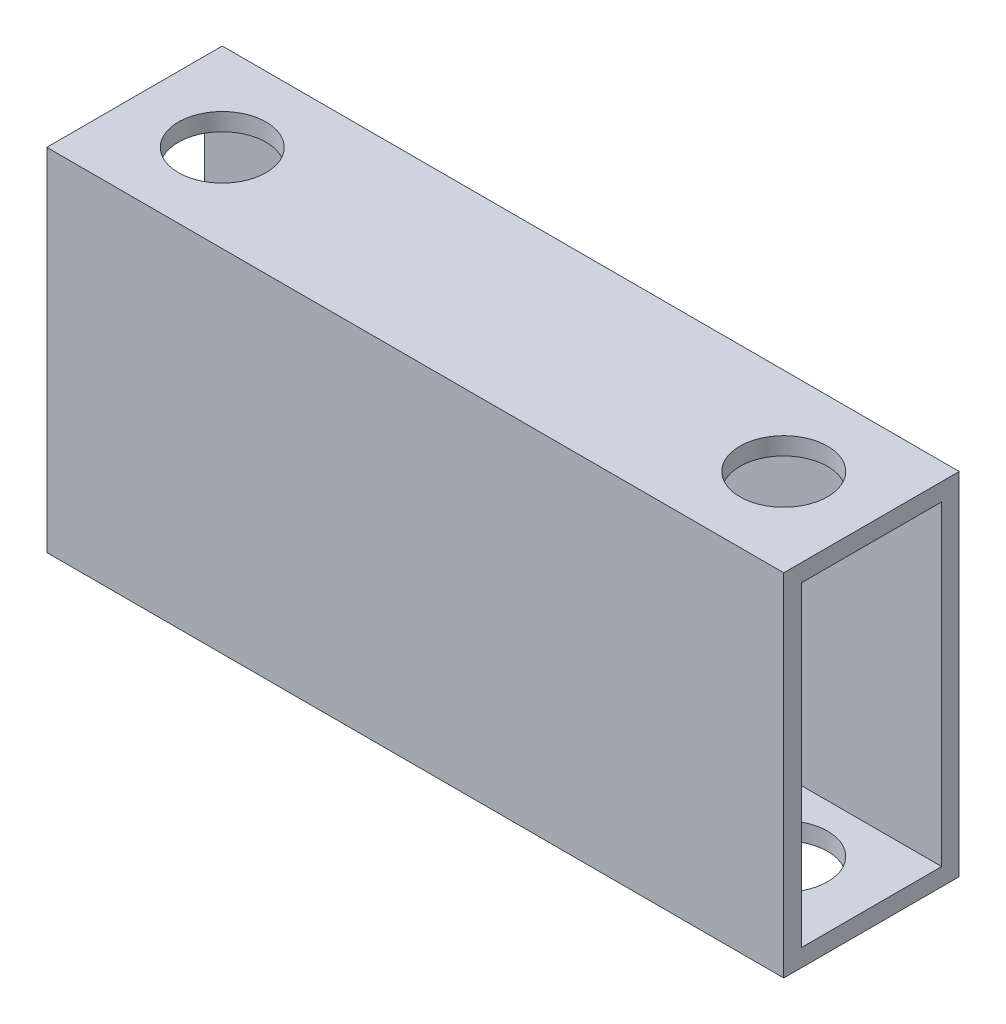
ISO-10303-21;
HEADER;
FILE_DESCRIPTION(('STEP AP214'),'2;1');
FILE_NAME('part.step','',(''),(''),'','','');
FILE_SCHEMA(('AUTOMOTIVE_DESIGN { 1 0 10303 214 1 1 1 1 }'));
ENDSEC;
DATA;
#1=APPLICATION_CONTEXT('core data for automotive mechanical design processes');
#2=APPLICATION_PROTOCOL_DEFINITION('international standard','automotive_design',2000,#1);
#3=PRODUCT_CONTEXT('',#1,'mechanical');
#4=PRODUCT('Part','Part','',(#3));
#5=PRODUCT_RELATED_PRODUCT_CATEGORY('part','',(#4));
#6=PRODUCT_DEFINITION_FORMATION('','',#4);
#7=PRODUCT_DEFINITION_CONTEXT('part definition',#1,'design');
#8=PRODUCT_DEFINITION('design','',#6,#7);
#9=PRODUCT_DEFINITION_SHAPE('','',#8);
#10=(LENGTH_UNIT() NAMED_UNIT(*) SI_UNIT(.MILLI.,.METRE.));
#11=(NAMED_UNIT(*) PLANE_ANGLE_UNIT() SI_UNIT($,.RADIAN.));
#12=(NAMED_UNIT(*) SI_UNIT($,.STERADIAN.) SOLID_ANGLE_UNIT());
#13=UNCERTAINTY_MEASURE_WITH_UNIT(LENGTH_MEASURE(1.E-05),#10,'distance_accuracy_value','');
#14=(GEOMETRIC_REPRESENTATION_CONTEXT(3) GLOBAL_UNCERTAINTY_ASSIGNED_CONTEXT((#13)) GLOBAL_UNIT_ASSIGNED_CONTEXT((#10,
#11,#12)) REPRESENTATION_CONTEXT('',''));
#15=CARTESIAN_POINT('',(0.,0.,0.));
#16=DIRECTION('',(0.,0.,1.));
#17=DIRECTION('',(1.,0.,0.));
#18=AXIS2_PLACEMENT_3D('',#15,#16,#17);
#19=CARTESIAN_POINT('',(-21.,-10.,-5.));
#20=DIRECTION('',(0.,0.,-1.));
#21=DIRECTION('',(-1.,0.,0.));
#22=AXIS2_PLACEMENT_3D('',#19,#20,#21);
#23=PLANE('',#22);
#24=DIRECTION('',(1.,0.,0.));
#25=VECTOR('',#24,1.);
#26=CARTESIAN_POINT('',(-21.,10.,-5.));
#27=LINE('',#26,#25);
#28=CARTESIAN_POINT('',(-21.,10.,-5.));
#29=VERTEX_POINT('',#28);
#30=CARTESIAN_POINT('',(21.,10.,-5.));
#31=VERTEX_POINT('',#30);
#32=EDGE_CURVE('E193',#29,#31,#27,.T.);
#33=ORIENTED_EDGE('',*,*,#32,.T.);
#34=DIRECTION('',(0.,1.,0.));
#35=VECTOR('',#34,1.);
#36=CARTESIAN_POINT('',(21.,-10.,-5.));
#37=LINE('',#36,#35);
#38=CARTESIAN_POINT('',(21.,-10.,-5.));
#39=VERTEX_POINT('',#38);
#40=EDGE_CURVE('E146',#39,#31,#37,.T.);
#41=ORIENTED_EDGE('',*,*,#40,.F.);
#42=DIRECTION('',(1.,0.,0.));
#43=VECTOR('',#42,1.);
#44=CARTESIAN_POINT('',(-21.,-10.,-5.));
#45=LINE('',#44,#43);
#46=CARTESIAN_POINT('',(-21.,-10.,-5.));
#47=VERTEX_POINT('',#46);
#48=EDGE_CURVE('E11',#47,#39,#45,.T.);
#49=ORIENTED_EDGE('',*,*,#48,.F.);
#50=DIRECTION('',(0.,1.,0.));
#51=VECTOR('',#50,1.);
#52=CARTESIAN_POINT('',(-21.,-10.,-5.));
#53=LINE('',#52,#51);
#54=EDGE_CURVE('E174',#47,#29,#53,.T.);
#55=ORIENTED_EDGE('',*,*,#54,.T.);
#56=EDGE_LOOP('',(#33,#41,#49,#55));
#57=FACE_BOUND('',#56,.T.);
#58=ADVANCED_FACE('F43',(#57),#23,.T.);
#59=CARTESIAN_POINT('',(-21.,-10.,5.));
#60=DIRECTION('',(0.,-1.,0.));
#61=DIRECTION('',(0.,0.,-1.));
#62=AXIS2_PLACEMENT_3D('',#59,#60,#61);
#63=PLANE('',#62);
#64=CARTESIAN_POINT('',(-16.,-10.,0.));
#65=DIRECTION('',(0.,1.,0.));
#66=DIRECTION('',(0.,0.,1.));
#67=AXIS2_PLACEMENT_3D('',#64,#65,#66);
#68=CIRCLE('',#67,2.5);
#69=CARTESIAN_POINT('',(-16.,-10.,2.5));
#70=VERTEX_POINT('',#69);
#71=EDGE_CURVE('E205',#70,#70,#68,.T.);
#72=ORIENTED_EDGE('',*,*,#71,.T.);
#73=EDGE_LOOP('',(#72));
#74=FACE_BOUND('',#73,.T.);
#75=CARTESIAN_POINT('',(16.,-10.,0.));
#76=DIRECTION('',(0.,1.,0.));
#77=DIRECTION('',(0.,0.,1.));
#78=AXIS2_PLACEMENT_3D('',#75,#76,#77);
#79=CIRCLE('',#78,2.5);
#80=CARTESIAN_POINT('',(16.,-10.,2.5));
#81=VERTEX_POINT('',#80);
#82=EDGE_CURVE('E225',#81,#81,#79,.T.);
#83=ORIENTED_EDGE('',*,*,#82,.T.);
#84=EDGE_LOOP('',(#83));
#85=FACE_BOUND('',#84,.T.);
#86=ORIENTED_EDGE('',*,*,#48,.T.);
#87=DIRECTION('',(0.,0.,-1.));
#88=VECTOR('',#87,1.);
#89=CARTESIAN_POINT('',(21.,-10.,5.));
#90=LINE('',#89,#88);
#91=CARTESIAN_POINT('',(21.,-10.,5.));
#92=VERTEX_POINT('',#91);
#93=EDGE_CURVE('E158',#92,#39,#90,.T.);
#94=ORIENTED_EDGE('',*,*,#93,.F.);
#95=DIRECTION('',(1.,0.,0.));
#96=VECTOR('',#95,1.);
#97=CARTESIAN_POINT('',(-21.,-10.,5.));
#98=LINE('',#97,#96);
#99=CARTESIAN_POINT('',(-21.,-10.,5.));
#100=VERTEX_POINT('',#99);
#101=EDGE_CURVE('E52',#100,#92,#98,.T.);
#102=ORIENTED_EDGE('',*,*,#101,.F.);
#103=DIRECTION('',(0.,0.,-1.));
#104=VECTOR('',#103,1.);
#105=CARTESIAN_POINT('',(-21.,-10.,5.));
#106=LINE('',#105,#104);
#107=EDGE_CURVE('E190',#100,#47,#106,.T.);
#108=ORIENTED_EDGE('',*,*,#107,.T.);
#109=EDGE_LOOP('',(#86,#94,#102,#108));
#110=FACE_BOUND('',#109,.T.);
#111=ADVANCED_FACE('F255',(#74,#85,#110),#63,.T.);
#112=CARTESIAN_POINT('',(-21.,-10.,5.));
#113=DIRECTION('',(0.,0.,1.));
#114=DIRECTION('',(1.,0.,0.));
#115=AXIS2_PLACEMENT_3D('',#112,#113,#114);
#116=PLANE('',#115);
#117=ORIENTED_EDGE('',*,*,#101,.T.);
#118=DIRECTION('',(0.,-1.,0.));
#119=VECTOR('',#118,1.);
#120=CARTESIAN_POINT('',(21.,-10.,5.));
#121=LINE('',#120,#119);
#122=CARTESIAN_POINT('',(21.,10.,5.));
#123=VERTEX_POINT('',#122);
#124=EDGE_CURVE('E154',#123,#92,#121,.T.);
#125=ORIENTED_EDGE('',*,*,#124,.F.);
#126=DIRECTION('',(1.,0.,0.));
#127=VECTOR('',#126,1.);
#128=CARTESIAN_POINT('',(-21.,10.,5.));
#129=LINE('',#128,#127);
#130=CARTESIAN_POINT('',(-21.,10.,5.));
#131=VERTEX_POINT('',#130);
#132=EDGE_CURVE('E197',#131,#123,#129,.T.);
#133=ORIENTED_EDGE('',*,*,#132,.F.);
#134=DIRECTION('',(0.,-1.,0.));
#135=VECTOR('',#134,1.);
#136=CARTESIAN_POINT('',(-21.,-10.,5.));
#137=LINE('',#136,#135);
#138=EDGE_CURVE('E186',#131,#100,#137,.T.);
#139=ORIENTED_EDGE('',*,*,#138,.T.);
#140=EDGE_LOOP('',(#117,#125,#133,#139));
#141=FACE_BOUND('',#140,.T.);
#142=ADVANCED_FACE('F259',(#141),#116,.T.);
#143=CARTESIAN_POINT('',(-21.,10.,5.));
#144=DIRECTION('',(0.,1.,0.));
#145=DIRECTION('',(0.,0.,1.));
#146=AXIS2_PLACEMENT_3D('',#143,#144,#145);
#147=PLANE('',#146);
#148=CARTESIAN_POINT('',(-16.,10.,0.));
#149=DIRECTION('',(0.,1.,0.));
#150=DIRECTION('',(0.,0.,1.));
#151=AXIS2_PLACEMENT_3D('',#148,#149,#150);
#152=CIRCLE('',#151,2.5);
#153=CARTESIAN_POINT('',(-16.,10.,2.5));
#154=VERTEX_POINT('',#153);
#155=EDGE_CURVE('E213',#154,#154,#152,.T.);
#156=ORIENTED_EDGE('',*,*,#155,.F.);
#157=EDGE_LOOP('',(#156));
#158=FACE_BOUND('',#157,.T.);
#159=CARTESIAN_POINT('',(16.,10.,0.));
#160=DIRECTION('',(0.,1.,0.));
#161=DIRECTION('',(0.,0.,1.));
#162=AXIS2_PLACEMENT_3D('',#159,#160,#161);
#163=CIRCLE('',#162,2.5);
#164=CARTESIAN_POINT('',(16.,10.,2.5));
#165=VERTEX_POINT('',#164);
#166=EDGE_CURVE('E219',#165,#165,#163,.T.);
#167=ORIENTED_EDGE('',*,*,#166,.F.);
#168=EDGE_LOOP('',(#167));
#169=FACE_BOUND('',#168,.T.);
#170=ORIENTED_EDGE('',*,*,#132,.T.);
#171=DIRECTION('',(0.,0.,1.));
#172=VECTOR('',#171,1.);
#173=CARTESIAN_POINT('',(21.,10.,5.));
#174=LINE('',#173,#172);
#175=EDGE_CURVE('E150',#31,#123,#174,.T.);
#176=ORIENTED_EDGE('',*,*,#175,.F.);
#177=ORIENTED_EDGE('',*,*,#32,.F.);
#178=DIRECTION('',(0.,0.,1.));
#179=VECTOR('',#178,1.);
#180=CARTESIAN_POINT('',(-21.,10.,5.));
#181=LINE('',#180,#179);
#182=EDGE_CURVE('E182',#29,#131,#181,.T.);
#183=ORIENTED_EDGE('',*,*,#182,.T.);
#184=EDGE_LOOP('',(#170,#176,#177,#183));
#185=FACE_BOUND('',#184,.T.);
#186=ADVANCED_FACE('F264',(#158,#169,#185),#147,.T.);
#187=CARTESIAN_POINT('',(-21.,0.,0.));
#188=DIRECTION('',(-1.,0.,0.));
#189=DIRECTION('',(0.,0.,1.));
#190=AXIS2_PLACEMENT_3D('',#187,#188,#189);
#191=PLANE('',#190);
#192=DIRECTION('',(0.,0.,-1.));
#193=VECTOR('',#192,1.);
#194=CARTESIAN_POINT('',(-21.,-9.,4.));
#195=LINE('',#194,#193);
#196=CARTESIAN_POINT('',(-21.,-9.,4.));
#197=VERTEX_POINT('',#196);
#198=CARTESIAN_POINT('',(-21.,-9.,-4.));
#199=VERTEX_POINT('',#198);
#200=EDGE_CURVE('E162',#197,#199,#195,.T.);
#201=ORIENTED_EDGE('',*,*,#200,.T.);
#202=DIRECTION('',(0.,1.,0.));
#203=VECTOR('',#202,1.);
#204=CARTESIAN_POINT('',(-21.,-9.,-4.));
#205=LINE('',#204,#203);
#206=CARTESIAN_POINT('',(-21.,9.,-4.));
#207=VERTEX_POINT('',#206);
#208=EDGE_CURVE('E116',#199,#207,#205,.T.);
#209=ORIENTED_EDGE('',*,*,#208,.T.);
#210=DIRECTION('',(0.,0.,1.));
#211=VECTOR('',#210,1.);
#212=CARTESIAN_POINT('',(-21.,9.,4.));
#213=LINE('',#212,#211);
#214=CARTESIAN_POINT('',(-21.,9.,4.));
#215=VERTEX_POINT('',#214);
#216=EDGE_CURVE('E60',#207,#215,#213,.T.);
#217=ORIENTED_EDGE('',*,*,#216,.T.);
#218=DIRECTION('',(0.,-1.,0.));
#219=VECTOR('',#218,1.);
#220=CARTESIAN_POINT('',(-21.,-9.,4.));
#221=LINE('',#220,#219);
#222=EDGE_CURVE('E122',#215,#197,#221,.T.);
#223=ORIENTED_EDGE('',*,*,#222,.T.);
#224=EDGE_LOOP('',(#201,#209,#217,#223));
#225=FACE_BOUND('',#224,.T.);
#226=ORIENTED_EDGE('',*,*,#54,.F.);
#227=ORIENTED_EDGE('',*,*,#107,.F.);
#228=ORIENTED_EDGE('',*,*,#138,.F.);
#229=ORIENTED_EDGE('',*,*,#182,.F.);
#230=EDGE_LOOP('',(#226,#227,#228,#229));
#231=FACE_BOUND('',#230,.T.);
#232=ADVANCED_FACE('F272',(#225,#231),#191,.T.);
#233=CARTESIAN_POINT('',(-21.,-9.,4.));
#234=DIRECTION('',(0.,-1.,0.));
#235=DIRECTION('',(0.,0.,-1.));
#236=AXIS2_PLACEMENT_3D('',#233,#234,#235);
#237=PLANE('',#236);
#238=CARTESIAN_POINT('',(-16.,-9.,0.));
#239=DIRECTION('',(0.,-1.,0.));
#240=DIRECTION('',(0.,0.,-1.));
#241=AXIS2_PLACEMENT_3D('',#238,#239,#240);
#242=CIRCLE('',#241,2.5);
#243=CARTESIAN_POINT('',(-16.,-9.,-2.5));
#244=VERTEX_POINT('',#243);
#245=EDGE_CURVE('E132',#244,#244,#242,.T.);
#246=ORIENTED_EDGE('',*,*,#245,.T.);
#247=EDGE_LOOP('',(#246));
#248=FACE_BOUND('',#247,.T.);
#249=CARTESIAN_POINT('',(16.,-9.,0.));
#250=DIRECTION('',(0.,-1.,0.));
#251=DIRECTION('',(0.,0.,-1.));
#252=AXIS2_PLACEMENT_3D('',#249,#250,#251);
#253=CIRCLE('',#252,2.5);
#254=CARTESIAN_POINT('',(16.,-9.,-2.5));
#255=VERTEX_POINT('',#254);
#256=EDGE_CURVE('E204',#255,#255,#253,.T.);
#257=ORIENTED_EDGE('',*,*,#256,.T.);
#258=EDGE_LOOP('',(#257));
#259=FACE_BOUND('',#258,.T.);
#260=DIRECTION('',(1.,0.,0.));
#261=VECTOR('',#260,1.);
#262=CARTESIAN_POINT('',(-21.,-9.,4.));
#263=LINE('',#262,#261);
#264=CARTESIAN_POINT('',(21.,-9.,4.));
#265=VERTEX_POINT('',#264);
#266=EDGE_CURVE('E127',#197,#265,#263,.T.);
#267=ORIENTED_EDGE('',*,*,#266,.T.);
#268=DIRECTION('',(0.,0.,-1.));
#269=VECTOR('',#268,1.);
#270=CARTESIAN_POINT('',(21.,-9.,4.));
#271=LINE('',#270,#269);
#272=CARTESIAN_POINT('',(21.,-9.,-4.));
#273=VERTEX_POINT('',#272);
#274=EDGE_CURVE('E125',#265,#273,#271,.T.);
#275=ORIENTED_EDGE('',*,*,#274,.T.);
#276=DIRECTION('',(1.,0.,0.));
#277=VECTOR('',#276,1.);
#278=CARTESIAN_POINT('',(-21.,-9.,-4.));
#279=LINE('',#278,#277);
#280=EDGE_CURVE('E109',#199,#273,#279,.T.);
#281=ORIENTED_EDGE('',*,*,#280,.F.);
#282=ORIENTED_EDGE('',*,*,#200,.F.);
#283=EDGE_LOOP('',(#267,#275,#281,#282));
#284=FACE_BOUND('',#283,.T.);
#285=ADVANCED_FACE('F126',(#248,#259,#284),#237,.F.);
#286=CARTESIAN_POINT('',(-21.,-9.,4.));
#287=DIRECTION('',(0.,0.,1.));
#288=DIRECTION('',(0.,-1.,0.));
#289=AXIS2_PLACEMENT_3D('',#286,#287,#288);
#290=PLANE('',#289);
#291=DIRECTION('',(1.,0.,0.));
#292=VECTOR('',#291,1.);
#293=CARTESIAN_POINT('',(-21.,9.,4.));
#294=LINE('',#293,#292);
#295=CARTESIAN_POINT('',(21.,9.,4.));
#296=VERTEX_POINT('',#295);
#297=EDGE_CURVE('E175',#215,#296,#294,.T.);
#298=ORIENTED_EDGE('',*,*,#297,.T.);
#299=DIRECTION('',(0.,-1.,0.));
#300=VECTOR('',#299,1.);
#301=CARTESIAN_POINT('',(21.,-9.,4.));
#302=LINE('',#301,#300);
#303=EDGE_CURVE('E140',#296,#265,#302,.T.);
#304=ORIENTED_EDGE('',*,*,#303,.T.);
#305=ORIENTED_EDGE('',*,*,#266,.F.);
#306=ORIENTED_EDGE('',*,*,#222,.F.);
#307=EDGE_LOOP('',(#298,#304,#305,#306));
#308=FACE_BOUND('',#307,.T.);
#309=ADVANCED_FACE('F286',(#308),#290,.F.);
#310=CARTESIAN_POINT('',(-21.,9.,4.));
#311=DIRECTION('',(0.,1.,0.));
#312=DIRECTION('',(0.,0.,1.));
#313=AXIS2_PLACEMENT_3D('',#310,#311,#312);
#314=PLANE('',#313);
#315=CARTESIAN_POINT('',(-16.,9.,0.));
#316=DIRECTION('',(0.,1.,0.));
#317=DIRECTION('',(0.,0.,1.));
#318=AXIS2_PLACEMENT_3D('',#315,#316,#317);
#319=CIRCLE('',#318,2.5);
#320=CARTESIAN_POINT('',(-16.,9.,2.5));
#321=VERTEX_POINT('',#320);
#322=EDGE_CURVE('E46',#321,#321,#319,.T.);
#323=ORIENTED_EDGE('',*,*,#322,.T.);
#324=EDGE_LOOP('',(#323));
#325=FACE_BOUND('',#324,.T.);
#326=CARTESIAN_POINT('',(16.,9.,0.));
#327=DIRECTION('',(0.,1.,0.));
#328=DIRECTION('',(0.,0.,1.));
#329=AXIS2_PLACEMENT_3D('',#326,#327,#328);
#330=CIRCLE('',#329,2.5);
#331=CARTESIAN_POINT('',(16.,9.,2.5));
#332=VERTEX_POINT('',#331);
#333=EDGE_CURVE('E201',#332,#332,#330,.T.);
#334=ORIENTED_EDGE('',*,*,#333,.T.);
#335=EDGE_LOOP('',(#334));
#336=FACE_BOUND('',#335,.T.);
#337=DIRECTION('',(1.,0.,0.));
#338=VECTOR('',#337,1.);
#339=CARTESIAN_POINT('',(-21.,9.,-4.));
#340=LINE('',#339,#338);
#341=CARTESIAN_POINT('',(21.,9.,-4.));
#342=VERTEX_POINT('',#341);
#343=EDGE_CURVE('E121',#207,#342,#340,.T.);
#344=ORIENTED_EDGE('',*,*,#343,.T.);
#345=DIRECTION('',(0.,0.,1.));
#346=VECTOR('',#345,1.);
#347=CARTESIAN_POINT('',(21.,9.,4.));
#348=LINE('',#347,#346);
#349=EDGE_CURVE('E136',#342,#296,#348,.T.);
#350=ORIENTED_EDGE('',*,*,#349,.T.);
#351=ORIENTED_EDGE('',*,*,#297,.F.);
#352=ORIENTED_EDGE('',*,*,#216,.F.);
#353=EDGE_LOOP('',(#344,#350,#351,#352));
#354=FACE_BOUND('',#353,.T.);
#355=ADVANCED_FACE('F236',(#325,#336,#354),#314,.F.);
#356=CARTESIAN_POINT('',(-21.,-9.,-4.));
#357=DIRECTION('',(0.,0.,-1.));
#358=DIRECTION('',(0.,1.,0.));
#359=AXIS2_PLACEMENT_3D('',#356,#357,#358);
#360=PLANE('',#359);
#361=ORIENTED_EDGE('',*,*,#280,.T.);
#362=DIRECTION('',(0.,1.,0.));
#363=VECTOR('',#362,1.);
#364=CARTESIAN_POINT('',(21.,-9.,-4.));
#365=LINE('',#364,#363);
#366=EDGE_CURVE('E113',#273,#342,#365,.T.);
#367=ORIENTED_EDGE('',*,*,#366,.T.);
#368=ORIENTED_EDGE('',*,*,#343,.F.);
#369=ORIENTED_EDGE('',*,*,#208,.F.);
#370=EDGE_LOOP('',(#361,#367,#368,#369));
#371=FACE_BOUND('',#370,.T.);
#372=ADVANCED_FACE('F111',(#371),#360,.F.);
#373=CARTESIAN_POINT('',(21.,0.,0.));
#374=DIRECTION('',(-1.,0.,0.));
#375=DIRECTION('',(0.,0.,1.));
#376=AXIS2_PLACEMENT_3D('',#373,#374,#375);
#377=PLANE('',#376);
#378=ORIENTED_EDGE('',*,*,#40,.T.);
#379=ORIENTED_EDGE('',*,*,#175,.T.);
#380=ORIENTED_EDGE('',*,*,#124,.T.);
#381=ORIENTED_EDGE('',*,*,#93,.T.);
#382=EDGE_LOOP('',(#378,#379,#380,#381));
#383=FACE_BOUND('',#382,.T.);
#384=ORIENTED_EDGE('',*,*,#274,.F.);
#385=ORIENTED_EDGE('',*,*,#303,.F.);
#386=ORIENTED_EDGE('',*,*,#349,.F.);
#387=ORIENTED_EDGE('',*,*,#366,.F.);
#388=EDGE_LOOP('',(#384,#385,#386,#387));
#389=FACE_BOUND('',#388,.T.);
#390=ADVANCED_FACE('F134',(#383,#389),#377,.F.);
#391=CARTESIAN_POINT('',(16.,-10.,0.));
#392=DIRECTION('',(0.,1.,0.));
#393=DIRECTION('',(0.,0.,1.));
#394=AXIS2_PLACEMENT_3D('',#391,#392,#393);
#395=CYLINDRICAL_SURFACE('',#394,2.5);
#396=ORIENTED_EDGE('',*,*,#166,.T.);
#397=EDGE_LOOP('',(#396));
#398=FACE_BOUND('',#397,.T.);
#399=ORIENTED_EDGE('',*,*,#333,.F.);
#400=EDGE_LOOP('',(#399));
#401=FACE_BOUND('',#400,.T.);
#402=ADVANCED_FACE('F241',(#398,#401),#395,.F.);
#403=CARTESIAN_POINT('',(-16.,-10.,0.));
#404=DIRECTION('',(0.,1.,0.));
#405=DIRECTION('',(0.,0.,1.));
#406=AXIS2_PLACEMENT_3D('',#403,#404,#405);
#407=CYLINDRICAL_SURFACE('',#406,2.5);
#408=ORIENTED_EDGE('',*,*,#155,.T.);
#409=EDGE_LOOP('',(#408));
#410=FACE_BOUND('',#409,.T.);
#411=ORIENTED_EDGE('',*,*,#322,.F.);
#412=EDGE_LOOP('',(#411));
#413=FACE_BOUND('',#412,.T.);
#414=ADVANCED_FACE('F238',(#410,#413),#407,.F.);
#415=ORIENTED_EDGE('',*,*,#82,.F.);
#416=EDGE_LOOP('',(#415));
#417=FACE_BOUND('',#416,.T.);
#418=ORIENTED_EDGE('',*,*,#256,.F.);
#419=EDGE_LOOP('',(#418));
#420=FACE_BOUND('',#419,.T.);
#421=ADVANCED_FACE('F240',(#417,#420),#395,.F.);
#422=ORIENTED_EDGE('',*,*,#71,.F.);
#423=EDGE_LOOP('',(#422));
#424=FACE_BOUND('',#423,.T.);
#425=ORIENTED_EDGE('',*,*,#245,.F.);
#426=EDGE_LOOP('',(#425));
#427=FACE_BOUND('',#426,.T.);
#428=ADVANCED_FACE('F244',(#424,#427),#407,.F.);
#429=CLOSED_SHELL('',(#58,#111,#142,#186,#232,#285,#309,#355,#372,#390,#402,#414,#421,#428));
#430=MANIFOLD_SOLID_BREP('B2',#429);
#431=ADVANCED_BREP_SHAPE_REPRESENTATION('',(#18,#430),#14);
#432=SHAPE_DEFINITION_REPRESENTATION(#9,#431);
ENDSEC;
END-ISO-10303-21;
